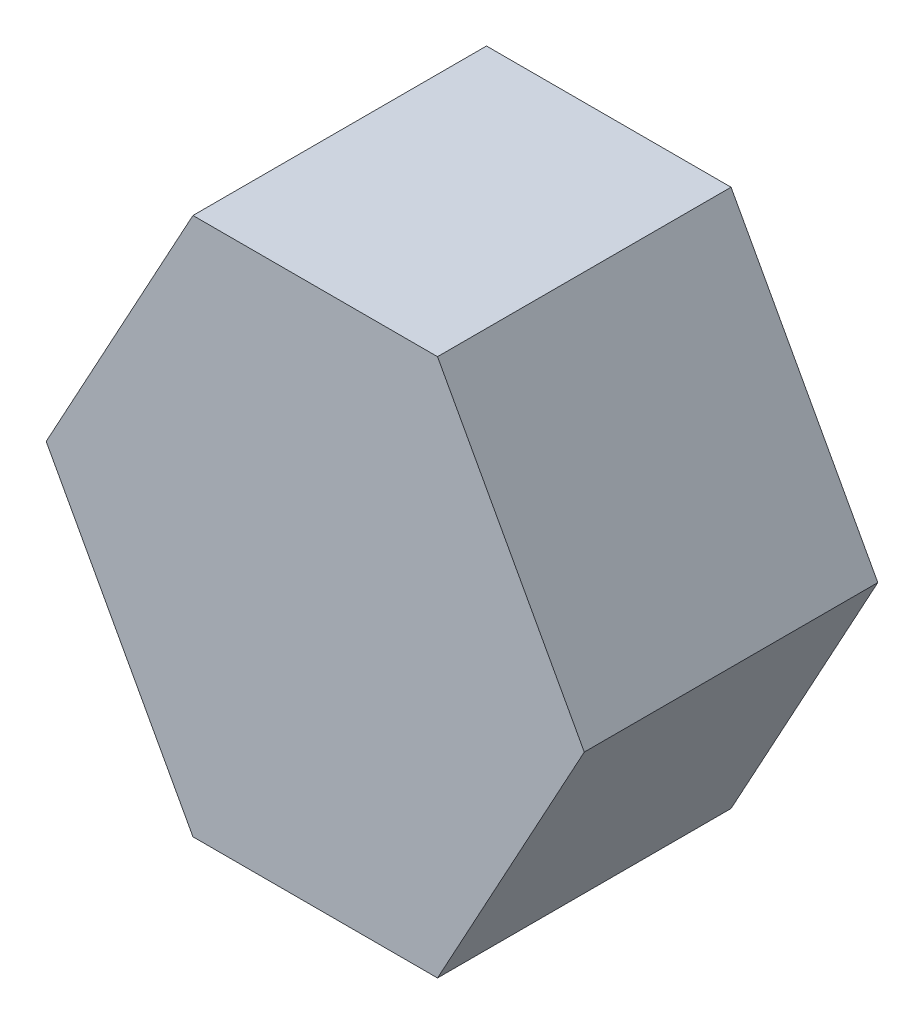
ISO-10303-21;
HEADER;
FILE_DESCRIPTION(('STEP AP214'),'2;1');
FILE_NAME('part.step','',(''),(''),'','','');
FILE_SCHEMA(('AUTOMOTIVE_DESIGN { 1 0 10303 214 1 1 1 1 }'));
ENDSEC;
DATA;
#1=APPLICATION_CONTEXT('core data for automotive mechanical design processes');
#2=APPLICATION_PROTOCOL_DEFINITION('international standard','automotive_design',2000,#1);
#3=PRODUCT_CONTEXT('',#1,'mechanical');
#4=PRODUCT('Part','Part','',(#3));
#5=PRODUCT_RELATED_PRODUCT_CATEGORY('part','',(#4));
#6=PRODUCT_DEFINITION_FORMATION('','',#4);
#7=PRODUCT_DEFINITION_CONTEXT('part definition',#1,'design');
#8=PRODUCT_DEFINITION('design','',#6,#7);
#9=PRODUCT_DEFINITION_SHAPE('','',#8);
#10=(LENGTH_UNIT() NAMED_UNIT(*) SI_UNIT(.MILLI.,.METRE.));
#11=(NAMED_UNIT(*) PLANE_ANGLE_UNIT() SI_UNIT($,.RADIAN.));
#12=(NAMED_UNIT(*) SI_UNIT($,.STERADIAN.) SOLID_ANGLE_UNIT());
#13=UNCERTAINTY_MEASURE_WITH_UNIT(LENGTH_MEASURE(1.E-05),#10,'distance_accuracy_value','');
#14=(GEOMETRIC_REPRESENTATION_CONTEXT(3) GLOBAL_UNCERTAINTY_ASSIGNED_CONTEXT((#13)) GLOBAL_UNIT_ASSIGNED_CONTEXT((#10,
#11,#12)) REPRESENTATION_CONTEXT('',''));
#15=CARTESIAN_POINT('',(0.,0.,0.));
#16=DIRECTION('',(0.,0.,1.));
#17=DIRECTION('',(1.,0.,0.));
#18=AXIS2_PLACEMENT_3D('',#15,#16,#17);
#19=CARTESIAN_POINT('',(0.,0.,6.928));
#20=DIRECTION('',(0.,0.,1.));
#21=DIRECTION('',(1.,0.,0.));
#22=AXIS2_PLACEMENT_3D('',#19,#20,#21);
#23=PLANE('',#22);
#24=DIRECTION('',(0.478890874860697,0.877874438615886,0.));
#25=VECTOR('',#24,1.);
#26=CARTESIAN_POINT('',(-4.89371341534224,2.66957846783394,6.928));
#27=LINE('',#26,#25);
#28=CARTESIAN_POINT('',(-6.35,0.,6.928));
#29=VERTEX_POINT('',#28);
#30=CARTESIAN_POINT('',(-2.886,6.35,6.928));
#31=VERTEX_POINT('',#30);
#32=EDGE_CURVE('E88',#29,#31,#27,.T.);
#33=ORIENTED_EDGE('',*,*,#32,.F.);
#34=DIRECTION('',(0.478890874860697,-0.877874438615886,0.));
#35=VECTOR('',#34,1.);
#36=CARTESIAN_POINT('',(-4.89371341534224,-2.66957846783394,6.928));
#37=LINE('',#36,#35);
#38=CARTESIAN_POINT('',(-2.886,-6.35,6.928));
#39=VERTEX_POINT('',#38);
#40=EDGE_CURVE('E98',#29,#39,#37,.T.);
#41=ORIENTED_EDGE('',*,*,#40,.T.);
#42=DIRECTION('',(1.,0.,0.));
#43=VECTOR('',#42,1.);
#44=CARTESIAN_POINT('',(-6.35,-6.35,6.928));
#45=LINE('',#44,#43);
#46=CARTESIAN_POINT('',(2.886,-6.35,6.928));
#47=VERTEX_POINT('',#46);
#48=EDGE_CURVE('E130',#39,#47,#45,.T.);
#49=ORIENTED_EDGE('',*,*,#48,.T.);
#50=DIRECTION('',(-0.478890874860697,-0.877874438615886,0.));
#51=VECTOR('',#50,1.);
#52=CARTESIAN_POINT('',(4.89371341534224,-2.66957846783394,6.928));
#53=LINE('',#52,#51);
#54=CARTESIAN_POINT('',(6.35,0.,6.928));
#55=VERTEX_POINT('',#54);
#56=EDGE_CURVE('E112',#55,#47,#53,.T.);
#57=ORIENTED_EDGE('',*,*,#56,.F.);
#58=DIRECTION('',(-0.478890874860697,0.877874438615886,0.));
#59=VECTOR('',#58,1.);
#60=CARTESIAN_POINT('',(4.89371341534224,2.66957846783394,6.928));
#61=LINE('',#60,#59);
#62=CARTESIAN_POINT('',(2.886,6.35,6.928));
#63=VERTEX_POINT('',#62);
#64=EDGE_CURVE('E119',#55,#63,#61,.T.);
#65=ORIENTED_EDGE('',*,*,#64,.T.);
#66=DIRECTION('',(-1.,0.,0.));
#67=VECTOR('',#66,1.);
#68=CARTESIAN_POINT('',(-6.35,6.35,6.928));
#69=LINE('',#68,#67);
#70=EDGE_CURVE('E100',#63,#31,#69,.T.);
#71=ORIENTED_EDGE('',*,*,#70,.T.);
#72=EDGE_LOOP('',(#33,#41,#49,#57,#65,#71));
#73=FACE_BOUND('',#72,.T.);
#74=ADVANCED_FACE('F33',(#73),#23,.T.);
#75=CARTESIAN_POINT('',(0.,0.,0.));
#76=DIRECTION('',(0.,0.,1.));
#77=DIRECTION('',(1.,0.,0.));
#78=AXIS2_PLACEMENT_3D('',#75,#76,#77);
#79=PLANE('',#78);
#80=CARTESIAN_POINT('',(0.,0.,0.));
#81=DIRECTION('',(0.,0.,-1.));
#82=DIRECTION('',(-1.,0.,0.));
#83=AXIS2_PLACEMENT_3D('',#80,#81,#82);
#84=CIRCLE('',#83,1.24999999999999);
#85=CARTESIAN_POINT('',(-1.24999999999999,0.,0.));
#86=VERTEX_POINT('',#85);
#87=EDGE_CURVE('E123',#86,#86,#84,.T.);
#88=ORIENTED_EDGE('',*,*,#87,.F.);
#89=EDGE_LOOP('',(#88));
#90=FACE_BOUND('',#89,.T.);
#91=DIRECTION('',(0.478890874860697,-0.877874438615886,0.));
#92=VECTOR('',#91,1.);
#93=CARTESIAN_POINT('',(-4.89371341534224,-2.66957846783394,0.));
#94=LINE('',#93,#92);
#95=CARTESIAN_POINT('',(-6.35,0.,0.));
#96=VERTEX_POINT('',#95);
#97=CARTESIAN_POINT('',(-2.886,-6.35,0.));
#98=VERTEX_POINT('',#97);
#99=EDGE_CURVE('E93',#96,#98,#94,.T.);
#100=ORIENTED_EDGE('',*,*,#99,.F.);
#101=DIRECTION('',(0.478890874860697,0.877874438615886,0.));
#102=VECTOR('',#101,1.);
#103=CARTESIAN_POINT('',(-4.89371341534224,2.66957846783394,0.));
#104=LINE('',#103,#102);
#105=CARTESIAN_POINT('',(-2.886,6.35,0.));
#106=VERTEX_POINT('',#105);
#107=EDGE_CURVE('E48',#96,#106,#104,.T.);
#108=ORIENTED_EDGE('',*,*,#107,.T.);
#109=DIRECTION('',(-1.,0.,0.));
#110=VECTOR('',#109,1.);
#111=CARTESIAN_POINT('',(-6.35,6.35,0.));
#112=LINE('',#111,#110);
#113=CARTESIAN_POINT('',(2.886,6.35,0.));
#114=VERTEX_POINT('',#113);
#115=EDGE_CURVE('E132',#114,#106,#112,.T.);
#116=ORIENTED_EDGE('',*,*,#115,.F.);
#117=DIRECTION('',(-0.478890874860697,0.877874438615886,0.));
#118=VECTOR('',#117,1.);
#119=CARTESIAN_POINT('',(4.89371341534224,2.66957846783394,0.));
#120=LINE('',#119,#118);
#121=CARTESIAN_POINT('',(6.35,0.,0.));
#122=VERTEX_POINT('',#121);
#123=EDGE_CURVE('E41',#122,#114,#120,.T.);
#124=ORIENTED_EDGE('',*,*,#123,.F.);
#125=DIRECTION('',(-0.478890874860697,-0.877874438615886,0.));
#126=VECTOR('',#125,1.);
#127=CARTESIAN_POINT('',(4.89371341534224,-2.66957846783394,0.));
#128=LINE('',#127,#126);
#129=CARTESIAN_POINT('',(2.886,-6.35,0.));
#130=VERTEX_POINT('',#129);
#131=EDGE_CURVE('E106',#122,#130,#128,.T.);
#132=ORIENTED_EDGE('',*,*,#131,.T.);
#133=DIRECTION('',(1.,0.,0.));
#134=VECTOR('',#133,1.);
#135=CARTESIAN_POINT('',(-6.35,-6.35,0.));
#136=LINE('',#135,#134);
#137=EDGE_CURVE('E129',#98,#130,#136,.T.);
#138=ORIENTED_EDGE('',*,*,#137,.F.);
#139=EDGE_LOOP('',(#100,#108,#116,#124,#132,#138));
#140=FACE_BOUND('',#139,.T.);
#141=ADVANCED_FACE('F143',(#90,#140),#79,.F.);
#142=CARTESIAN_POINT('',(-6.35,-6.35,6.928));
#143=DIRECTION('',(0.,1.,0.));
#144=DIRECTION('',(-1.,0.,0.));
#145=AXIS2_PLACEMENT_3D('',#142,#143,#144);
#146=PLANE('',#145);
#147=DIRECTION('',(0.,0.,1.));
#148=VECTOR('',#147,1.);
#149=CARTESIAN_POINT('',(-2.886,-6.35,6.928));
#150=LINE('',#149,#148);
#151=EDGE_CURVE('E11',#98,#39,#150,.T.);
#152=ORIENTED_EDGE('',*,*,#151,.F.);
#153=ORIENTED_EDGE('',*,*,#137,.T.);
#154=DIRECTION('',(0.,0.,-1.));
#155=VECTOR('',#154,1.);
#156=CARTESIAN_POINT('',(2.886,-6.35,32.7229767485239));
#157=LINE('',#156,#155);
#158=EDGE_CURVE('E103',#47,#130,#157,.T.);
#159=ORIENTED_EDGE('',*,*,#158,.F.);
#160=ORIENTED_EDGE('',*,*,#48,.F.);
#161=EDGE_LOOP('',(#152,#153,#159,#160));
#162=FACE_BOUND('',#161,.T.);
#163=ADVANCED_FACE('F35',(#162),#146,.F.);
#164=CARTESIAN_POINT('',(-6.35,6.35,6.928));
#165=DIRECTION('',(0.,-1.,0.));
#166=DIRECTION('',(0.,0.,-1.));
#167=AXIS2_PLACEMENT_3D('',#164,#165,#166);
#168=PLANE('',#167);
#169=ORIENTED_EDGE('',*,*,#115,.T.);
#170=DIRECTION('',(0.,0.,-1.));
#171=VECTOR('',#170,1.);
#172=CARTESIAN_POINT('',(-2.886,6.35,32.7229767485239));
#173=LINE('',#172,#171);
#174=EDGE_CURVE('E146',#31,#106,#173,.T.);
#175=ORIENTED_EDGE('',*,*,#174,.F.);
#176=ORIENTED_EDGE('',*,*,#70,.F.);
#177=DIRECTION('',(0.,0.,-1.));
#178=VECTOR('',#177,1.);
#179=CARTESIAN_POINT('',(2.886,6.35,24.0629767485239));
#180=LINE('',#179,#178);
#181=EDGE_CURVE('E115',#63,#114,#180,.T.);
#182=ORIENTED_EDGE('',*,*,#181,.T.);
#183=EDGE_LOOP('',(#169,#175,#176,#182));
#184=FACE_BOUND('',#183,.T.);
#185=ADVANCED_FACE('F145',(#184),#168,.F.);
#186=CARTESIAN_POINT('',(0.,0.,4.));
#187=DIRECTION('',(0.,0.,-1.));
#188=DIRECTION('',(-1.,0.,0.));
#189=AXIS2_PLACEMENT_3D('',#186,#187,#188);
#190=CONICAL_SURFACE('',#189,1.25,1.02974425867665);
#191=CARTESIAN_POINT('',(0.,0.,4.75107577378445));
#192=VERTEX_POINT('',#191);
#193=VERTEX_LOOP('',#192);
#194=FACE_BOUND('',#193,.T.);
#195=CARTESIAN_POINT('',(0.,0.,4.));
#196=DIRECTION('',(0.,0.,-1.));
#197=DIRECTION('',(-1.,0.,0.));
#198=AXIS2_PLACEMENT_3D('',#195,#196,#197);
#199=CIRCLE('',#198,1.25);
#200=CARTESIAN_POINT('',(-1.25,0.,4.));
#201=VERTEX_POINT('',#200);
#202=EDGE_CURVE('E126',#201,#201,#199,.T.);
#203=ORIENTED_EDGE('',*,*,#202,.T.);
#204=EDGE_LOOP('',(#203));
#205=FACE_BOUND('',#204,.T.);
#206=ADVANCED_FACE('F150',(#194,#205),#190,.F.);
#207=CARTESIAN_POINT('',(0.,0.,0.));
#208=DIRECTION('',(0.,0.,-1.));
#209=DIRECTION('',(-1.,0.,0.));
#210=AXIS2_PLACEMENT_3D('',#207,#208,#209);
#211=CYLINDRICAL_SURFACE('',#210,1.24999999999999);
#212=ORIENTED_EDGE('',*,*,#202,.F.);
#213=EDGE_LOOP('',(#212));
#214=FACE_BOUND('',#213,.T.);
#215=ORIENTED_EDGE('',*,*,#87,.T.);
#216=EDGE_LOOP('',(#215));
#217=FACE_BOUND('',#216,.T.);
#218=ADVANCED_FACE('F155',(#214,#217),#211,.F.);
#219=CARTESIAN_POINT('',(2.886,6.35,24.0629767485239));
#220=DIRECTION('',(0.877874438615886,0.478890874860697,0.));
#221=DIRECTION('',(-0.478890874860697,0.877874438615886,0.));
#222=AXIS2_PLACEMENT_3D('',#219,#220,#221);
#223=PLANE('',#222);
#224=ORIENTED_EDGE('',*,*,#64,.F.);
#225=DIRECTION('',(0.,0.,-1.));
#226=VECTOR('',#225,1.);
#227=CARTESIAN_POINT('',(6.35,0.,24.0629767485239));
#228=LINE('',#227,#226);
#229=EDGE_CURVE('E116',#55,#122,#228,.T.);
#230=ORIENTED_EDGE('',*,*,#229,.T.);
#231=ORIENTED_EDGE('',*,*,#123,.T.);
#232=ORIENTED_EDGE('',*,*,#181,.F.);
#233=EDGE_LOOP('',(#224,#230,#231,#232));
#234=FACE_BOUND('',#233,.T.);
#235=ADVANCED_FACE('F141',(#234),#223,.T.);
#236=CARTESIAN_POINT('',(2.886,-6.35,32.7229767485239));
#237=DIRECTION('',(-0.877874438615885,0.478890874860697,0.));
#238=DIRECTION('',(-0.478890874860697,-0.877874438615886,0.));
#239=AXIS2_PLACEMENT_3D('',#236,#237,#238);
#240=PLANE('',#239);
#241=ORIENTED_EDGE('',*,*,#229,.F.);
#242=ORIENTED_EDGE('',*,*,#56,.T.);
#243=ORIENTED_EDGE('',*,*,#158,.T.);
#244=ORIENTED_EDGE('',*,*,#131,.F.);
#245=EDGE_LOOP('',(#241,#242,#243,#244));
#246=FACE_BOUND('',#245,.T.);
#247=ADVANCED_FACE('F171',(#246),#240,.F.);
#248=CARTESIAN_POINT('',(-2.886,-6.35,24.0629767485239));
#249=DIRECTION('',(-0.877874438615886,-0.478890874860697,0.));
#250=DIRECTION('',(0.478890874860697,-0.877874438615886,0.));
#251=AXIS2_PLACEMENT_3D('',#248,#249,#250);
#252=PLANE('',#251);
#253=ORIENTED_EDGE('',*,*,#40,.F.);
#254=DIRECTION('',(0.,0.,-1.));
#255=VECTOR('',#254,1.);
#256=CARTESIAN_POINT('',(-6.35,0.,24.0629767485239));
#257=LINE('',#256,#255);
#258=EDGE_CURVE('E85',#29,#96,#257,.T.);
#259=ORIENTED_EDGE('',*,*,#258,.T.);
#260=ORIENTED_EDGE('',*,*,#99,.T.);
#261=ORIENTED_EDGE('',*,*,#151,.T.);
#262=EDGE_LOOP('',(#253,#259,#260,#261));
#263=FACE_BOUND('',#262,.T.);
#264=ADVANCED_FACE('F102',(#263),#252,.T.);
#265=CARTESIAN_POINT('',(-2.886,6.35,32.7229767485239));
#266=DIRECTION('',(0.877874438615885,-0.478890874860697,0.));
#267=DIRECTION('',(0.478890874860697,0.877874438615886,0.));
#268=AXIS2_PLACEMENT_3D('',#265,#266,#267);
#269=PLANE('',#268);
#270=ORIENTED_EDGE('',*,*,#258,.F.);
#271=ORIENTED_EDGE('',*,*,#32,.T.);
#272=ORIENTED_EDGE('',*,*,#174,.T.);
#273=ORIENTED_EDGE('',*,*,#107,.F.);
#274=EDGE_LOOP('',(#270,#271,#272,#273));
#275=FACE_BOUND('',#274,.T.);
#276=ADVANCED_FACE('F87',(#275),#269,.F.);
#277=CLOSED_SHELL('',(#74,#141,#163,#185,#206,#218,#235,#247,#264,#276));
#278=MANIFOLD_SOLID_BREP('B2',#277);
#279=ADVANCED_BREP_SHAPE_REPRESENTATION('',(#18,#278),#14);
#280=SHAPE_DEFINITION_REPRESENTATION(#9,#279);
ENDSEC;
END-ISO-10303-21;
